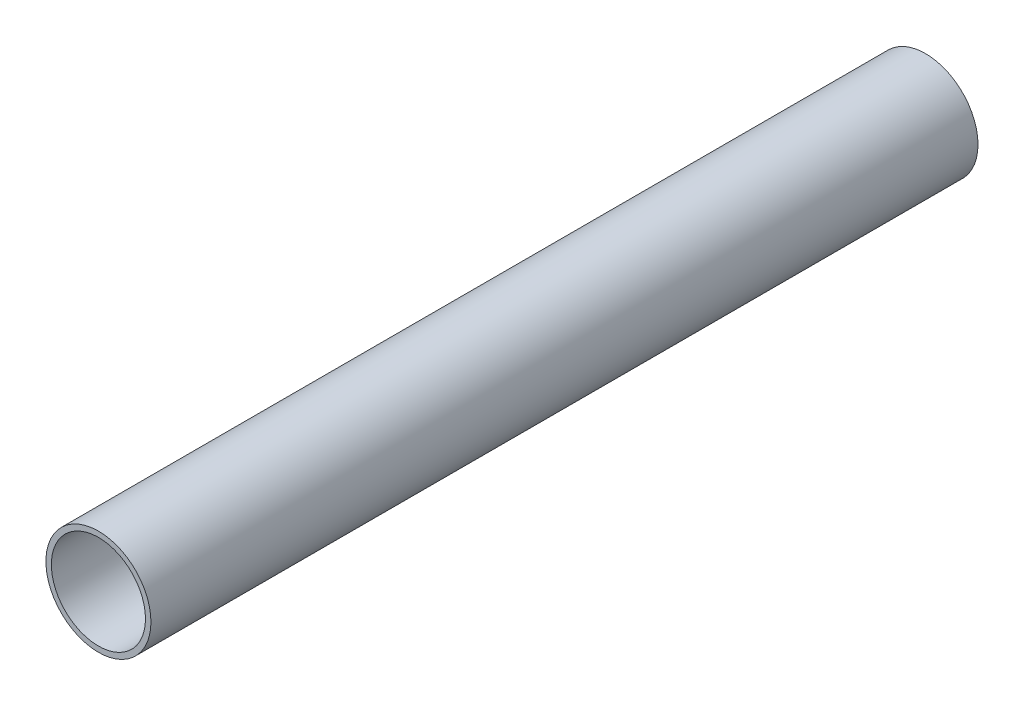
ISO-10303-21;
HEADER;
FILE_DESCRIPTION(('STEP AP214'),'2;1');
FILE_NAME('part.step','',(''),(''),'','','');
FILE_SCHEMA(('AUTOMOTIVE_DESIGN { 1 0 10303 214 1 1 1 1 }'));
ENDSEC;
DATA;
#1=APPLICATION_CONTEXT('core data for automotive mechanical design processes');
#2=APPLICATION_PROTOCOL_DEFINITION('international standard','automotive_design',2000,#1);
#3=PRODUCT_CONTEXT('',#1,'mechanical');
#4=PRODUCT('Part','Part','',(#3));
#5=PRODUCT_RELATED_PRODUCT_CATEGORY('part','',(#4));
#6=PRODUCT_DEFINITION_FORMATION('','',#4);
#7=PRODUCT_DEFINITION_CONTEXT('part definition',#1,'design');
#8=PRODUCT_DEFINITION('design','',#6,#7);
#9=PRODUCT_DEFINITION_SHAPE('','',#8);
#10=(LENGTH_UNIT() NAMED_UNIT(*) SI_UNIT(.MILLI.,.METRE.));
#11=(NAMED_UNIT(*) PLANE_ANGLE_UNIT() SI_UNIT($,.RADIAN.));
#12=(NAMED_UNIT(*) SI_UNIT($,.STERADIAN.) SOLID_ANGLE_UNIT());
#13=UNCERTAINTY_MEASURE_WITH_UNIT(LENGTH_MEASURE(1.E-05),#10,'distance_accuracy_value','');
#14=(GEOMETRIC_REPRESENTATION_CONTEXT(3) GLOBAL_UNCERTAINTY_ASSIGNED_CONTEXT((#13)) GLOBAL_UNIT_ASSIGNED_CONTEXT((#10,
#11,#12)) REPRESENTATION_CONTEXT('',''));
#15=CARTESIAN_POINT('',(0.,0.,0.));
#16=DIRECTION('',(0.,0.,1.));
#17=DIRECTION('',(1.,0.,0.));
#18=AXIS2_PLACEMENT_3D('',#15,#16,#17);
#19=CARTESIAN_POINT('',(0.,0.,250.));
#20=DIRECTION('',(0.,0.,1.));
#21=DIRECTION('',(1.,0.,0.));
#22=AXIS2_PLACEMENT_3D('',#19,#20,#21);
#23=PLANE('',#22);
#24=CARTESIAN_POINT('',(0.,0.,250.));
#25=DIRECTION('',(0.,0.,1.));
#26=DIRECTION('',(1.,0.,0.));
#27=AXIS2_PLACEMENT_3D('',#24,#25,#26);
#28=CIRCLE('',#27,15.875);
#29=CARTESIAN_POINT('',(15.875,0.,250.));
#30=VERTEX_POINT('',#29);
#31=EDGE_CURVE('E10',#30,#30,#28,.T.);
#32=ORIENTED_EDGE('',*,*,#31,.T.);
#33=EDGE_LOOP('',(#32));
#34=FACE_BOUND('',#33,.T.);
#35=CARTESIAN_POINT('',(0.,0.,250.));
#36=DIRECTION('',(0.,0.,1.));
#37=DIRECTION('',(1.,0.,0.));
#38=AXIS2_PLACEMENT_3D('',#35,#36,#37);
#39=CIRCLE('',#38,14.224);
#40=CARTESIAN_POINT('',(14.224,0.,250.));
#41=VERTEX_POINT('',#40);
#42=EDGE_CURVE('E41',#41,#41,#39,.T.);
#43=ORIENTED_EDGE('',*,*,#42,.F.);
#44=EDGE_LOOP('',(#43));
#45=FACE_BOUND('',#44,.T.);
#46=ADVANCED_FACE('F30',(#34,#45),#23,.T.);
#47=CARTESIAN_POINT('',(0.,0.,0.));
#48=DIRECTION('',(0.,0.,1.));
#49=DIRECTION('',(1.,0.,0.));
#50=AXIS2_PLACEMENT_3D('',#47,#48,#49);
#51=PLANE('',#50);
#52=CARTESIAN_POINT('',(0.,0.,0.));
#53=DIRECTION('',(0.,0.,1.));
#54=DIRECTION('',(1.,0.,0.));
#55=AXIS2_PLACEMENT_3D('',#52,#53,#54);
#56=CIRCLE('',#55,15.875);
#57=CARTESIAN_POINT('',(15.875,0.,0.));
#58=VERTEX_POINT('',#57);
#59=EDGE_CURVE('E34',#58,#58,#56,.T.);
#60=ORIENTED_EDGE('',*,*,#59,.F.);
#61=EDGE_LOOP('',(#60));
#62=FACE_BOUND('',#61,.T.);
#63=CARTESIAN_POINT('',(0.,0.,0.));
#64=DIRECTION('',(0.,0.,1.));
#65=DIRECTION('',(1.,0.,0.));
#66=AXIS2_PLACEMENT_3D('',#63,#64,#65);
#67=CIRCLE('',#66,14.224);
#68=CARTESIAN_POINT('',(14.224,0.,0.));
#69=VERTEX_POINT('',#68);
#70=EDGE_CURVE('E43',#69,#69,#67,.T.);
#71=ORIENTED_EDGE('',*,*,#70,.T.);
#72=EDGE_LOOP('',(#71));
#73=FACE_BOUND('',#72,.T.);
#74=ADVANCED_FACE('F53',(#62,#73),#51,.F.);
#75=CARTESIAN_POINT('',(0.,0.,250.));
#76=DIRECTION('',(0.,0.,-1.));
#77=DIRECTION('',(-1.,0.,0.));
#78=AXIS2_PLACEMENT_3D('',#75,#76,#77);
#79=CYLINDRICAL_SURFACE('',#78,15.875);
#80=ORIENTED_EDGE('',*,*,#31,.F.);
#81=EDGE_LOOP('',(#80));
#82=FACE_BOUND('',#81,.T.);
#83=ORIENTED_EDGE('',*,*,#59,.T.);
#84=EDGE_LOOP('',(#83));
#85=FACE_BOUND('',#84,.T.);
#86=ADVANCED_FACE('F32',(#82,#85),#79,.T.);
#87=CARTESIAN_POINT('',(0.,0.,250.));
#88=DIRECTION('',(0.,0.,-1.));
#89=DIRECTION('',(-1.,0.,0.));
#90=AXIS2_PLACEMENT_3D('',#87,#88,#89);
#91=CYLINDRICAL_SURFACE('',#90,14.224);
#92=ORIENTED_EDGE('',*,*,#42,.T.);
#93=EDGE_LOOP('',(#92));
#94=FACE_BOUND('',#93,.T.);
#95=ORIENTED_EDGE('',*,*,#70,.F.);
#96=EDGE_LOOP('',(#95));
#97=FACE_BOUND('',#96,.T.);
#98=ADVANCED_FACE('F49',(#94,#97),#91,.F.);
#99=CLOSED_SHELL('',(#46,#74,#86,#98));
#100=MANIFOLD_SOLID_BREP('B2',#99);
#101=ADVANCED_BREP_SHAPE_REPRESENTATION('',(#18,#100),#14);
#102=SHAPE_DEFINITION_REPRESENTATION(#9,#101);
ENDSEC;
END-ISO-10303-21;
